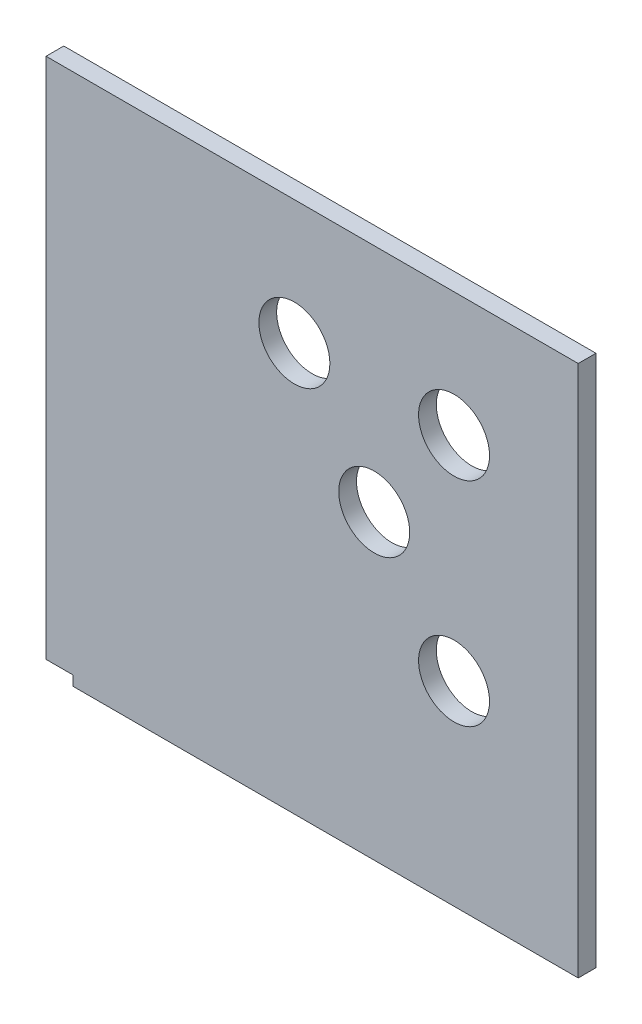
ISO-10303-21;
HEADER;
FILE_DESCRIPTION(('STEP AP214'),'2;1');
FILE_NAME('part.step','',(''),(''),'','','');
FILE_SCHEMA(('AUTOMOTIVE_DESIGN { 1 0 10303 214 1 1 1 1 }'));
ENDSEC;
DATA;
#1=APPLICATION_CONTEXT('core data for automotive mechanical design processes');
#2=APPLICATION_PROTOCOL_DEFINITION('international standard','automotive_design',2000,#1);
#3=PRODUCT_CONTEXT('',#1,'mechanical');
#4=PRODUCT('Part','Part','',(#3));
#5=PRODUCT_RELATED_PRODUCT_CATEGORY('part','',(#4));
#6=PRODUCT_DEFINITION_FORMATION('','',#4);
#7=PRODUCT_DEFINITION_CONTEXT('part definition',#1,'design');
#8=PRODUCT_DEFINITION('design','',#6,#7);
#9=PRODUCT_DEFINITION_SHAPE('','',#8);
#10=(LENGTH_UNIT() NAMED_UNIT(*) SI_UNIT(.MILLI.,.METRE.));
#11=(NAMED_UNIT(*) PLANE_ANGLE_UNIT() SI_UNIT($,.RADIAN.));
#12=(NAMED_UNIT(*) SI_UNIT($,.STERADIAN.) SOLID_ANGLE_UNIT());
#13=UNCERTAINTY_MEASURE_WITH_UNIT(LENGTH_MEASURE(1.E-05),#10,'distance_accuracy_value','');
#14=(GEOMETRIC_REPRESENTATION_CONTEXT(3) GLOBAL_UNCERTAINTY_ASSIGNED_CONTEXT((#13)) GLOBAL_UNIT_ASSIGNED_CONTEXT((#10,
#11,#12)) REPRESENTATION_CONTEXT('',''));
#15=CARTESIAN_POINT('',(0.,0.,0.));
#16=DIRECTION('',(0.,0.,1.));
#17=DIRECTION('',(1.,0.,0.));
#18=AXIS2_PLACEMENT_3D('',#15,#16,#17);
#19=CARTESIAN_POINT('',(150.,-150.,10.));
#20=DIRECTION('',(-1.,0.,0.));
#21=DIRECTION('',(0.,0.,1.));
#22=AXIS2_PLACEMENT_3D('',#19,#20,#21);
#23=PLANE('',#22);
#24=DIRECTION('',(0.,1.,0.));
#25=VECTOR('',#24,1.);
#26=CARTESIAN_POINT('',(150.,-150.,0.));
#27=LINE('',#26,#25);
#28=CARTESIAN_POINT('',(150.,-150.,0.));
#29=VERTEX_POINT('',#28);
#30=CARTESIAN_POINT('',(150.,150.,0.));
#31=VERTEX_POINT('',#30);
#32=EDGE_CURVE('E144',#29,#31,#27,.T.);
#33=ORIENTED_EDGE('',*,*,#32,.T.);
#34=DIRECTION('',(0.,0.,-1.));
#35=VECTOR('',#34,1.);
#36=CARTESIAN_POINT('',(150.,150.,10.));
#37=LINE('',#36,#35);
#38=CARTESIAN_POINT('',(150.,150.,10.));
#39=VERTEX_POINT('',#38);
#40=EDGE_CURVE('E48',#39,#31,#37,.T.);
#41=ORIENTED_EDGE('',*,*,#40,.F.);
#42=DIRECTION('',(0.,1.,0.));
#43=VECTOR('',#42,1.);
#44=CARTESIAN_POINT('',(150.,-150.,10.));
#45=LINE('',#44,#43);
#46=CARTESIAN_POINT('',(150.,-150.,10.));
#47=VERTEX_POINT('',#46);
#48=EDGE_CURVE('E147',#47,#39,#45,.T.);
#49=ORIENTED_EDGE('',*,*,#48,.F.);
#50=DIRECTION('',(0.,0.,-1.));
#51=VECTOR('',#50,1.);
#52=CARTESIAN_POINT('',(150.,-150.,10.));
#53=LINE('',#52,#51);
#54=EDGE_CURVE('E156',#47,#29,#53,.T.);
#55=ORIENTED_EDGE('',*,*,#54,.T.);
#56=EDGE_LOOP('',(#33,#41,#49,#55));
#57=FACE_BOUND('',#56,.T.);
#58=ADVANCED_FACE('F41',(#57),#23,.F.);
#59=CARTESIAN_POINT('',(-150.,150.,10.));
#60=DIRECTION('',(0.,-1.,0.));
#61=DIRECTION('',(0.,0.,-1.));
#62=AXIS2_PLACEMENT_3D('',#59,#60,#61);
#63=PLANE('',#62);
#64=DIRECTION('',(-1.,0.,0.));
#65=VECTOR('',#64,1.);
#66=CARTESIAN_POINT('',(-150.,150.,0.));
#67=LINE('',#66,#65);
#68=CARTESIAN_POINT('',(-150.,150.,0.));
#69=VERTEX_POINT('',#68);
#70=EDGE_CURVE('E101',#31,#69,#67,.T.);
#71=ORIENTED_EDGE('',*,*,#70,.T.);
#72=DIRECTION('',(0.,0.,-1.));
#73=VECTOR('',#72,1.);
#74=CARTESIAN_POINT('',(-150.,150.,10.));
#75=LINE('',#74,#73);
#76=CARTESIAN_POINT('',(-150.,150.,10.));
#77=VERTEX_POINT('',#76);
#78=EDGE_CURVE('E98',#77,#69,#75,.T.);
#79=ORIENTED_EDGE('',*,*,#78,.F.);
#80=DIRECTION('',(-1.,0.,0.));
#81=VECTOR('',#80,1.);
#82=CARTESIAN_POINT('',(-150.,150.,10.));
#83=LINE('',#82,#81);
#84=EDGE_CURVE('E150',#39,#77,#83,.T.);
#85=ORIENTED_EDGE('',*,*,#84,.F.);
#86=ORIENTED_EDGE('',*,*,#40,.T.);
#87=EDGE_LOOP('',(#71,#79,#85,#86));
#88=FACE_BOUND('',#87,.T.);
#89=ADVANCED_FACE('F166',(#88),#63,.F.);
#90=CARTESIAN_POINT('',(-150.,-150.,10.));
#91=DIRECTION('',(1.,0.,0.));
#92=DIRECTION('',(0.,0.,-1.));
#93=AXIS2_PLACEMENT_3D('',#90,#91,#92);
#94=PLANE('',#93);
#95=DIRECTION('',(0.,-1.,0.));
#96=VECTOR('',#95,1.);
#97=CARTESIAN_POINT('',(-150.,-150.,0.));
#98=LINE('',#97,#96);
#99=CARTESIAN_POINT('',(-150.,-144.449658905878,0.));
#100=VERTEX_POINT('',#99);
#101=EDGE_CURVE('E91',#69,#100,#98,.T.);
#102=ORIENTED_EDGE('',*,*,#101,.T.);
#103=DIRECTION('',(0.,0.,-1.));
#104=VECTOR('',#103,1.);
#105=CARTESIAN_POINT('',(-150.,-144.449658905878,10.));
#106=LINE('',#105,#104);
#107=CARTESIAN_POINT('',(-150.,-144.449658905878,10.));
#108=VERTEX_POINT('',#107);
#109=EDGE_CURVE('E96',#108,#100,#106,.T.);
#110=ORIENTED_EDGE('',*,*,#109,.F.);
#111=DIRECTION('',(0.,-1.,0.));
#112=VECTOR('',#111,1.);
#113=CARTESIAN_POINT('',(-150.,-150.,10.));
#114=LINE('',#113,#112);
#115=EDGE_CURVE('E152',#77,#108,#114,.T.);
#116=ORIENTED_EDGE('',*,*,#115,.F.);
#117=ORIENTED_EDGE('',*,*,#78,.T.);
#118=EDGE_LOOP('',(#102,#110,#116,#117));
#119=FACE_BOUND('',#118,.T.);
#120=ADVANCED_FACE('F93',(#119),#94,.F.);
#121=CARTESIAN_POINT('',(-150.,-150.,10.));
#122=DIRECTION('',(0.,1.,0.));
#123=DIRECTION('',(0.,0.,1.));
#124=AXIS2_PLACEMENT_3D('',#121,#122,#123);
#125=PLANE('',#124);
#126=DIRECTION('',(1.,0.,0.));
#127=VECTOR('',#126,1.);
#128=CARTESIAN_POINT('',(-150.,-150.,10.));
#129=LINE('',#128,#127);
#130=CARTESIAN_POINT('',(-134.681205632166,-150.,10.));
#131=VERTEX_POINT('',#130);
#132=EDGE_CURVE('E154',#131,#47,#129,.T.);
#133=ORIENTED_EDGE('',*,*,#132,.F.);
#134=DIRECTION('',(0.,0.,-1.));
#135=VECTOR('',#134,1.);
#136=CARTESIAN_POINT('',(-134.681205632166,-150.,10.));
#137=LINE('',#136,#135);
#138=CARTESIAN_POINT('',(-134.681205632166,-150.,0.));
#139=VERTEX_POINT('',#138);
#140=EDGE_CURVE('E119',#131,#139,#137,.T.);
#141=ORIENTED_EDGE('',*,*,#140,.T.);
#142=DIRECTION('',(1.,0.,0.));
#143=VECTOR('',#142,1.);
#144=CARTESIAN_POINT('',(-150.,-150.,0.));
#145=LINE('',#144,#143);
#146=EDGE_CURVE('E100',#139,#29,#145,.T.);
#147=ORIENTED_EDGE('',*,*,#146,.T.);
#148=ORIENTED_EDGE('',*,*,#54,.F.);
#149=EDGE_LOOP('',(#133,#141,#147,#148));
#150=FACE_BOUND('',#149,.T.);
#151=ADVANCED_FACE('F173',(#150),#125,.F.);
#152=CARTESIAN_POINT('',(0.,0.,10.));
#153=DIRECTION('',(0.,0.,-1.));
#154=DIRECTION('',(-1.,0.,0.));
#155=AXIS2_PLACEMENT_3D('',#152,#153,#154);
#156=PLANE('',#155);
#157=CARTESIAN_POINT('',(-10.,80.,10.));
#158=DIRECTION('',(0.,0.,1.));
#159=DIRECTION('',(1.,0.,0.));
#160=AXIS2_PLACEMENT_3D('',#157,#158,#159);
#161=CIRCLE('',#160,20.);
#162=CARTESIAN_POINT('',(9.99999999999998,80.,10.));
#163=VERTEX_POINT('',#162);
#164=EDGE_CURVE('E122',#163,#163,#161,.T.);
#165=ORIENTED_EDGE('',*,*,#164,.F.);
#166=EDGE_LOOP('',(#165));
#167=FACE_BOUND('',#166,.T.);
#168=CARTESIAN_POINT('',(80.,-40.,10.));
#169=DIRECTION('',(0.,0.,1.));
#170=DIRECTION('',(1.,0.,0.));
#171=AXIS2_PLACEMENT_3D('',#168,#169,#170);
#172=CIRCLE('',#171,20.);
#173=CARTESIAN_POINT('',(100.,-40.,10.));
#174=VERTEX_POINT('',#173);
#175=EDGE_CURVE('E127',#174,#174,#172,.T.);
#176=ORIENTED_EDGE('',*,*,#175,.F.);
#177=EDGE_LOOP('',(#176));
#178=FACE_BOUND('',#177,.T.);
#179=CARTESIAN_POINT('',(80.,80.,10.));
#180=DIRECTION('',(0.,0.,1.));
#181=DIRECTION('',(1.,0.,0.));
#182=AXIS2_PLACEMENT_3D('',#179,#180,#181);
#183=CIRCLE('',#182,20.);
#184=CARTESIAN_POINT('',(100.,80.,10.));
#185=VERTEX_POINT('',#184);
#186=EDGE_CURVE('E135',#185,#185,#183,.T.);
#187=ORIENTED_EDGE('',*,*,#186,.F.);
#188=EDGE_LOOP('',(#187));
#189=FACE_BOUND('',#188,.T.);
#190=CARTESIAN_POINT('',(35.,20.,10.));
#191=DIRECTION('',(0.,0.,1.));
#192=DIRECTION('',(1.,0.,0.));
#193=AXIS2_PLACEMENT_3D('',#190,#191,#192);
#194=CIRCLE('',#193,20.);
#195=CARTESIAN_POINT('',(55.,20.,10.));
#196=VERTEX_POINT('',#195);
#197=EDGE_CURVE('E138',#196,#196,#194,.T.);
#198=ORIENTED_EDGE('',*,*,#197,.F.);
#199=EDGE_LOOP('',(#198));
#200=FACE_BOUND('',#199,.T.);
#201=ORIENTED_EDGE('',*,*,#115,.T.);
#202=DIRECTION('',(-1.,0.,0.));
#203=VECTOR('',#202,1.);
#204=CARTESIAN_POINT('',(-134.681205632166,-144.449658905878,10.));
#205=LINE('',#204,#203);
#206=CARTESIAN_POINT('',(-134.681205632166,-144.449658905878,10.));
#207=VERTEX_POINT('',#206);
#208=EDGE_CURVE('E113',#207,#108,#205,.T.);
#209=ORIENTED_EDGE('',*,*,#208,.F.);
#210=DIRECTION('',(0.,1.,0.));
#211=VECTOR('',#210,1.);
#212=CARTESIAN_POINT('',(-134.681205632166,-119.949658905878,10.));
#213=LINE('',#212,#211);
#214=EDGE_CURVE('E59',#131,#207,#213,.T.);
#215=ORIENTED_EDGE('',*,*,#214,.F.);
#216=ORIENTED_EDGE('',*,*,#132,.T.);
#217=ORIENTED_EDGE('',*,*,#48,.T.);
#218=ORIENTED_EDGE('',*,*,#84,.T.);
#219=EDGE_LOOP('',(#201,#209,#215,#216,#217,#218));
#220=FACE_BOUND('',#219,.T.);
#221=ADVANCED_FACE('F176',(#167,#178,#189,#200,#220),#156,.F.);
#222=CARTESIAN_POINT('',(0.,0.,0.));
#223=DIRECTION('',(0.,0.,-1.));
#224=DIRECTION('',(-1.,0.,0.));
#225=AXIS2_PLACEMENT_3D('',#222,#223,#224);
#226=PLANE('',#225);
#227=DIRECTION('',(0.,-1.,0.));
#228=VECTOR('',#227,1.);
#229=CARTESIAN_POINT('',(-134.681205632166,0.,0.));
#230=LINE('',#229,#228);
#231=CARTESIAN_POINT('',(-134.681205632166,-144.449658905878,0.));
#232=VERTEX_POINT('',#231);
#233=EDGE_CURVE('E11',#232,#139,#230,.T.);
#234=ORIENTED_EDGE('',*,*,#233,.F.);
#235=DIRECTION('',(1.,0.,0.));
#236=VECTOR('',#235,1.);
#237=CARTESIAN_POINT('',(-150.,-144.449658905878,0.));
#238=LINE('',#237,#236);
#239=EDGE_CURVE('E104',#100,#232,#238,.T.);
#240=ORIENTED_EDGE('',*,*,#239,.F.);
#241=ORIENTED_EDGE('',*,*,#101,.F.);
#242=ORIENTED_EDGE('',*,*,#70,.F.);
#243=ORIENTED_EDGE('',*,*,#32,.F.);
#244=ORIENTED_EDGE('',*,*,#146,.F.);
#245=EDGE_LOOP('',(#234,#240,#241,#242,#243,#244));
#246=FACE_BOUND('',#245,.T.);
#247=CARTESIAN_POINT('',(-10.,80.,0.));
#248=DIRECTION('',(0.,0.,1.));
#249=DIRECTION('',(1.,0.,0.));
#250=AXIS2_PLACEMENT_3D('',#247,#248,#249);
#251=CIRCLE('',#250,20.);
#252=CARTESIAN_POINT('',(9.99999999999998,80.,0.));
#253=VERTEX_POINT('',#252);
#254=EDGE_CURVE('E130',#253,#253,#251,.T.);
#255=ORIENTED_EDGE('',*,*,#254,.T.);
#256=EDGE_LOOP('',(#255));
#257=FACE_BOUND('',#256,.T.);
#258=CARTESIAN_POINT('',(80.,-40.,0.));
#259=DIRECTION('',(0.,0.,1.));
#260=DIRECTION('',(1.,0.,0.));
#261=AXIS2_PLACEMENT_3D('',#258,#259,#260);
#262=CIRCLE('',#261,20.);
#263=CARTESIAN_POINT('',(100.,-40.,0.));
#264=VERTEX_POINT('',#263);
#265=EDGE_CURVE('E123',#264,#264,#262,.T.);
#266=ORIENTED_EDGE('',*,*,#265,.T.);
#267=EDGE_LOOP('',(#266));
#268=FACE_BOUND('',#267,.T.);
#269=CARTESIAN_POINT('',(80.,80.,0.));
#270=DIRECTION('',(0.,0.,1.));
#271=DIRECTION('',(1.,0.,0.));
#272=AXIS2_PLACEMENT_3D('',#269,#270,#271);
#273=CIRCLE('',#272,20.);
#274=CARTESIAN_POINT('',(100.,80.,0.));
#275=VERTEX_POINT('',#274);
#276=EDGE_CURVE('E126',#275,#275,#273,.T.);
#277=ORIENTED_EDGE('',*,*,#276,.T.);
#278=EDGE_LOOP('',(#277));
#279=FACE_BOUND('',#278,.T.);
#280=CARTESIAN_POINT('',(35.,20.,0.));
#281=DIRECTION('',(0.,0.,1.));
#282=DIRECTION('',(1.,0.,0.));
#283=AXIS2_PLACEMENT_3D('',#280,#281,#282);
#284=CIRCLE('',#283,20.);
#285=CARTESIAN_POINT('',(55.,20.,0.));
#286=VERTEX_POINT('',#285);
#287=EDGE_CURVE('E141',#286,#286,#284,.T.);
#288=ORIENTED_EDGE('',*,*,#287,.T.);
#289=EDGE_LOOP('',(#288));
#290=FACE_BOUND('',#289,.T.);
#291=ADVANCED_FACE('F105',(#246,#257,#268,#279,#290),#226,.T.);
#292=CARTESIAN_POINT('',(35.,20.,0.));
#293=DIRECTION('',(0.,0.,1.));
#294=DIRECTION('',(1.,0.,0.));
#295=AXIS2_PLACEMENT_3D('',#292,#293,#294);
#296=CYLINDRICAL_SURFACE('',#295,20.);
#297=ORIENTED_EDGE('',*,*,#287,.F.);
#298=EDGE_LOOP('',(#297));
#299=FACE_BOUND('',#298,.T.);
#300=ORIENTED_EDGE('',*,*,#197,.T.);
#301=EDGE_LOOP('',(#300));
#302=FACE_BOUND('',#301,.T.);
#303=ADVANCED_FACE('F184',(#299,#302),#296,.F.);
#304=CARTESIAN_POINT('',(80.,80.,10.));
#305=DIRECTION('',(0.,0.,-1.));
#306=DIRECTION('',(-1.,0.,0.));
#307=AXIS2_PLACEMENT_3D('',#304,#305,#306);
#308=CYLINDRICAL_SURFACE('',#307,20.);
#309=ORIENTED_EDGE('',*,*,#186,.T.);
#310=EDGE_LOOP('',(#309));
#311=FACE_BOUND('',#310,.T.);
#312=ORIENTED_EDGE('',*,*,#276,.F.);
#313=EDGE_LOOP('',(#312));
#314=FACE_BOUND('',#313,.T.);
#315=ADVANCED_FACE('F225',(#311,#314),#308,.F.);
#316=CARTESIAN_POINT('',(80.,-40.,10.));
#317=DIRECTION('',(0.,0.,-1.));
#318=DIRECTION('',(-1.,0.,0.));
#319=AXIS2_PLACEMENT_3D('',#316,#317,#318);
#320=CYLINDRICAL_SURFACE('',#319,20.);
#321=ORIENTED_EDGE('',*,*,#175,.T.);
#322=EDGE_LOOP('',(#321));
#323=FACE_BOUND('',#322,.T.);
#324=ORIENTED_EDGE('',*,*,#265,.F.);
#325=EDGE_LOOP('',(#324));
#326=FACE_BOUND('',#325,.T.);
#327=ADVANCED_FACE('F216',(#323,#326),#320,.F.);
#328=CARTESIAN_POINT('',(-10.,80.,10.));
#329=DIRECTION('',(0.,0.,-1.));
#330=DIRECTION('',(-1.,0.,0.));
#331=AXIS2_PLACEMENT_3D('',#328,#329,#330);
#332=CYLINDRICAL_SURFACE('',#331,20.);
#333=ORIENTED_EDGE('',*,*,#164,.T.);
#334=EDGE_LOOP('',(#333));
#335=FACE_BOUND('',#334,.T.);
#336=ORIENTED_EDGE('',*,*,#254,.F.);
#337=EDGE_LOOP('',(#336));
#338=FACE_BOUND('',#337,.T.);
#339=ADVANCED_FACE('F212',(#335,#338),#332,.F.);
#340=CARTESIAN_POINT('',(-134.681205632166,-119.949658905878,-15.));
#341=DIRECTION('',(1.,0.,0.));
#342=DIRECTION('',(0.,0.,-1.));
#343=AXIS2_PLACEMENT_3D('',#340,#341,#342);
#344=PLANE('',#343);
#345=ORIENTED_EDGE('',*,*,#214,.T.);
#346=DIRECTION('',(0.,0.,1.));
#347=VECTOR('',#346,1.);
#348=CARTESIAN_POINT('',(-134.681205632166,-144.449658905878,0.));
#349=LINE('',#348,#347);
#350=EDGE_CURVE('E54',#232,#207,#349,.T.);
#351=ORIENTED_EDGE('',*,*,#350,.F.);
#352=ORIENTED_EDGE('',*,*,#233,.T.);
#353=ORIENTED_EDGE('',*,*,#140,.F.);
#354=EDGE_LOOP('',(#345,#351,#352,#353));
#355=FACE_BOUND('',#354,.T.);
#356=ADVANCED_FACE('F174',(#355),#344,.F.);
#357=CARTESIAN_POINT('',(0.,-144.449658905878,0.));
#358=DIRECTION('',(0.,-1.,0.));
#359=DIRECTION('',(0.,0.,-1.));
#360=AXIS2_PLACEMENT_3D('',#357,#358,#359);
#361=PLANE('',#360);
#362=ORIENTED_EDGE('',*,*,#109,.T.);
#363=ORIENTED_EDGE('',*,*,#239,.T.);
#364=ORIENTED_EDGE('',*,*,#350,.T.);
#365=ORIENTED_EDGE('',*,*,#208,.T.);
#366=EDGE_LOOP('',(#362,#363,#364,#365));
#367=FACE_BOUND('',#366,.T.);
#368=ADVANCED_FACE('F111',(#367),#361,.T.);
#369=CLOSED_SHELL('',(#58,#89,#120,#151,#221,#291,#303,#315,#327,#339,#356,#368));
#370=MANIFOLD_SOLID_BREP('B2',#369);
#371=ADVANCED_BREP_SHAPE_REPRESENTATION('',(#18,#370),#14);
#372=SHAPE_DEFINITION_REPRESENTATION(#9,#371);
ENDSEC;
END-ISO-10303-21;
